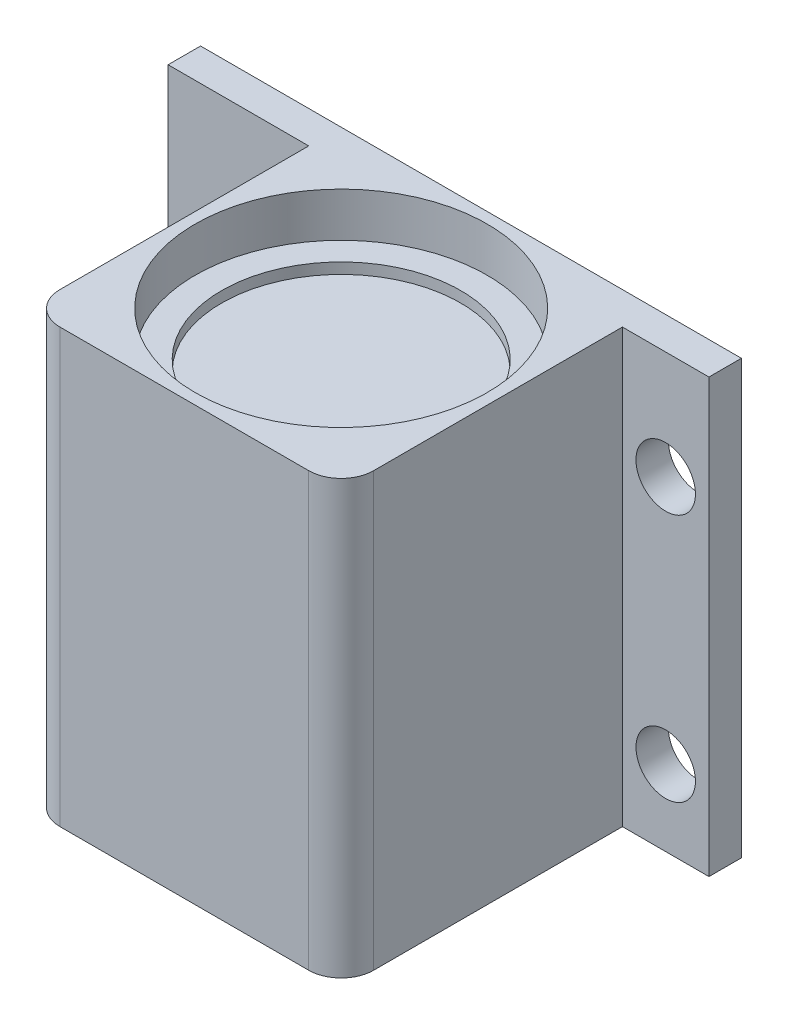
ISO-10303-21;
HEADER;
FILE_DESCRIPTION(('STEP AP214'),'2;1');
FILE_NAME('part.step','',(''),(''),'','','');
FILE_SCHEMA(('AUTOMOTIVE_DESIGN { 1 0 10303 214 1 1 1 1 }'));
ENDSEC;
DATA;
#1=APPLICATION_CONTEXT('core data for automotive mechanical design processes');
#2=APPLICATION_PROTOCOL_DEFINITION('international standard','automotive_design',2000,#1);
#3=PRODUCT_CONTEXT('',#1,'mechanical');
#4=PRODUCT('Part','Part','',(#3));
#5=PRODUCT_RELATED_PRODUCT_CATEGORY('part','',(#4));
#6=PRODUCT_DEFINITION_FORMATION('','',#4);
#7=PRODUCT_DEFINITION_CONTEXT('part definition',#1,'design');
#8=PRODUCT_DEFINITION('design','',#6,#7);
#9=PRODUCT_DEFINITION_SHAPE('','',#8);
#10=(LENGTH_UNIT() NAMED_UNIT(*) SI_UNIT(.MILLI.,.METRE.));
#11=(NAMED_UNIT(*) PLANE_ANGLE_UNIT() SI_UNIT($,.RADIAN.));
#12=(NAMED_UNIT(*) SI_UNIT($,.STERADIAN.) SOLID_ANGLE_UNIT());
#13=UNCERTAINTY_MEASURE_WITH_UNIT(LENGTH_MEASURE(1.E-05),#10,'distance_accuracy_value','');
#14=(GEOMETRIC_REPRESENTATION_CONTEXT(3) GLOBAL_UNCERTAINTY_ASSIGNED_CONTEXT((#13)) GLOBAL_UNIT_ASSIGNED_CONTEXT((#10,
#11,#12)) REPRESENTATION_CONTEXT('',''));
#15=CARTESIAN_POINT('',(0.,0.,0.));
#16=DIRECTION('',(0.,0.,1.));
#17=DIRECTION('',(1.,0.,0.));
#18=AXIS2_PLACEMENT_3D('',#15,#16,#17);
#19=CARTESIAN_POINT('',(0.,0.,0.));
#20=DIRECTION('',(0.,-1.,0.));
#21=DIRECTION('',(0.,0.,-1.));
#22=AXIS2_PLACEMENT_3D('',#19,#20,#21);
#23=PLANE('',#22);
#24=DIRECTION('',(1.,0.,0.));
#25=VECTOR('',#24,1.);
#26=CARTESIAN_POINT('',(14.5,0.,14.5));
#27=LINE('',#26,#25);
#28=CARTESIAN_POINT('',(-11.5,0.,14.5));
#29=VERTEX_POINT('',#28);
#30=CARTESIAN_POINT('',(11.5,0.,14.5));
#31=VERTEX_POINT('',#30);
#32=EDGE_CURVE('E273',#29,#31,#27,.T.);
#33=ORIENTED_EDGE('',*,*,#32,.T.);
#34=CARTESIAN_POINT('',(11.5,0.,11.5));
#35=DIRECTION('',(0.,-1.,0.));
#36=DIRECTION('',(0.,0.,-1.));
#37=AXIS2_PLACEMENT_3D('',#34,#35,#36);
#38=CIRCLE('',#37,3.);
#39=CARTESIAN_POINT('',(14.5,0.,11.5));
#40=VERTEX_POINT('',#39);
#41=EDGE_CURVE('E255',#31,#40,#38,.F.);
#42=ORIENTED_EDGE('',*,*,#41,.T.);
#43=DIRECTION('',(0.,0.,-1.));
#44=VECTOR('',#43,1.);
#45=CARTESIAN_POINT('',(14.5,0.,-11.5));
#46=LINE('',#45,#44);
#47=CARTESIAN_POINT('',(14.5,0.,-11.5));
#48=VERTEX_POINT('',#47);
#49=EDGE_CURVE('E271',#40,#48,#46,.T.);
#50=ORIENTED_EDGE('',*,*,#49,.T.);
#51=DIRECTION('',(1.,0.,0.));
#52=VECTOR('',#51,1.);
#53=CARTESIAN_POINT('',(22.5,0.,-11.5));
#54=LINE('',#53,#52);
#55=CARTESIAN_POINT('',(22.5,0.,-11.5));
#56=VERTEX_POINT('',#55);
#57=EDGE_CURVE('E283',#48,#56,#54,.T.);
#58=ORIENTED_EDGE('',*,*,#57,.T.);
#59=DIRECTION('',(0.,0.,-1.));
#60=VECTOR('',#59,1.);
#61=CARTESIAN_POINT('',(22.5,0.,-14.5));
#62=LINE('',#61,#60);
#63=CARTESIAN_POINT('',(22.5,0.,-14.5));
#64=VERTEX_POINT('',#63);
#65=EDGE_CURVE('E134',#56,#64,#62,.T.);
#66=ORIENTED_EDGE('',*,*,#65,.T.);
#67=DIRECTION('',(-1.,0.,0.));
#68=VECTOR('',#67,1.);
#69=CARTESIAN_POINT('',(-22.5,0.,-14.5));
#70=LINE('',#69,#68);
#71=CARTESIAN_POINT('',(-27.5000000000003,0.,-14.5));
#72=VERTEX_POINT('',#71);
#73=EDGE_CURVE('E121',#64,#72,#70,.T.);
#74=ORIENTED_EDGE('',*,*,#73,.T.);
#75=DIRECTION('',(0.,0.,1.));
#76=VECTOR('',#75,1.);
#77=CARTESIAN_POINT('',(-27.5000000000003,0.,-54.8112887414928));
#78=LINE('',#77,#76);
#79=CARTESIAN_POINT('',(-27.5000000000003,0.,-11.5));
#80=VERTEX_POINT('',#79);
#81=EDGE_CURVE('E129',#72,#80,#78,.T.);
#82=ORIENTED_EDGE('',*,*,#81,.T.);
#83=DIRECTION('',(1.,0.,0.));
#84=VECTOR('',#83,1.);
#85=CARTESIAN_POINT('',(-14.5,0.,-11.5));
#86=LINE('',#85,#84);
#87=CARTESIAN_POINT('',(-14.5,0.,-11.5));
#88=VERTEX_POINT('',#87);
#89=EDGE_CURVE('E293',#80,#88,#86,.T.);
#90=ORIENTED_EDGE('',*,*,#89,.T.);
#91=DIRECTION('',(0.,0.,1.));
#92=VECTOR('',#91,1.);
#93=CARTESIAN_POINT('',(-14.5,0.,14.5));
#94=LINE('',#93,#92);
#95=CARTESIAN_POINT('',(-14.5,0.,11.5));
#96=VERTEX_POINT('',#95);
#97=EDGE_CURVE('E286',#88,#96,#94,.T.);
#98=ORIENTED_EDGE('',*,*,#97,.T.);
#99=CARTESIAN_POINT('',(-11.5,0.,11.5));
#100=DIRECTION('',(0.,-1.,0.));
#101=DIRECTION('',(0.,0.,-1.));
#102=AXIS2_PLACEMENT_3D('',#99,#100,#101);
#103=CIRCLE('',#102,3.);
#104=EDGE_CURVE('E248',#96,#29,#103,.F.);
#105=ORIENTED_EDGE('',*,*,#104,.T.);
#106=EDGE_LOOP('',(#33,#42,#50,#58,#66,#74,#82,#90,#98,#105));
#107=FACE_BOUND('',#106,.T.);
#108=CARTESIAN_POINT('',(0.,1.2E-05,0.));
#109=DIRECTION('',(0.,1.,0.));
#110=DIRECTION('',(0.,0.,1.));
#111=AXIS2_PLACEMENT_3D('',#108,#109,#110);
#112=CIRCLE('',#111,13.5);
#113=CARTESIAN_POINT('',(0.,1.2E-05,13.5));
#114=VERTEX_POINT('',#113);
#115=EDGE_CURVE('E205',#114,#114,#112,.T.);
#116=ORIENTED_EDGE('',*,*,#115,.F.);
#117=EDGE_LOOP('',(#116));
#118=FACE_BOUND('',#117,.T.);
#119=ADVANCED_FACE('F43',(#107,#118),#23,.F.);
#120=CARTESIAN_POINT('',(97.4999999999998,-39.9999999999999,-34.4999999999999));
#121=DIRECTION('',(0.,-1.,0.));
#122=DIRECTION('',(0.,0.,-1.));
#123=AXIS2_PLACEMENT_3D('',#120,#121,#122);
#124=PLANE('',#123);
#125=DIRECTION('',(0.,0.,-1.));
#126=VECTOR('',#125,1.);
#127=CARTESIAN_POINT('',(14.5,-40.,-11.4999999999999));
#128=LINE('',#127,#126);
#129=CARTESIAN_POINT('',(14.5,-40.,11.5));
#130=VERTEX_POINT('',#129);
#131=CARTESIAN_POINT('',(14.5,-40.,-11.5));
#132=VERTEX_POINT('',#131);
#133=EDGE_CURVE('E261',#130,#132,#128,.T.);
#134=ORIENTED_EDGE('',*,*,#133,.F.);
#135=CARTESIAN_POINT('',(11.5,-40.,11.5));
#136=DIRECTION('',(0.,-1.,0.));
#137=DIRECTION('',(0.,0.,-1.));
#138=AXIS2_PLACEMENT_3D('',#135,#136,#137);
#139=CIRCLE('',#138,3.);
#140=CARTESIAN_POINT('',(11.5,-40.,14.5));
#141=VERTEX_POINT('',#140);
#142=EDGE_CURVE('E55',#130,#141,#139,.T.);
#143=ORIENTED_EDGE('',*,*,#142,.T.);
#144=DIRECTION('',(1.,0.,0.));
#145=VECTOR('',#144,1.);
#146=CARTESIAN_POINT('',(14.5,-40.,14.5));
#147=LINE('',#146,#145);
#148=CARTESIAN_POINT('',(-11.5,-40.,14.5));
#149=VERTEX_POINT('',#148);
#150=EDGE_CURVE('E263',#149,#141,#147,.T.);
#151=ORIENTED_EDGE('',*,*,#150,.F.);
#152=CARTESIAN_POINT('',(-11.5,-40.,11.5));
#153=DIRECTION('',(0.,-1.,0.));
#154=DIRECTION('',(0.,0.,-1.));
#155=AXIS2_PLACEMENT_3D('',#152,#153,#154);
#156=CIRCLE('',#155,3.);
#157=CARTESIAN_POINT('',(-14.5,-40.,11.5));
#158=VERTEX_POINT('',#157);
#159=EDGE_CURVE('E56',#149,#158,#156,.T.);
#160=ORIENTED_EDGE('',*,*,#159,.T.);
#161=DIRECTION('',(0.,0.,1.));
#162=VECTOR('',#161,1.);
#163=CARTESIAN_POINT('',(-14.5,-40.,14.5000000000001));
#164=LINE('',#163,#162);
#165=CARTESIAN_POINT('',(-14.5,-40.,-11.5));
#166=VERTEX_POINT('',#165);
#167=EDGE_CURVE('E270',#166,#158,#164,.T.);
#168=ORIENTED_EDGE('',*,*,#167,.F.);
#169=DIRECTION('',(1.,0.,0.));
#170=VECTOR('',#169,1.);
#171=CARTESIAN_POINT('',(-14.5,-40.,-11.5));
#172=LINE('',#171,#170);
#173=CARTESIAN_POINT('',(-27.5000000000003,-40.,-11.5));
#174=VERTEX_POINT('',#173);
#175=EDGE_CURVE('E139',#174,#166,#172,.T.);
#176=ORIENTED_EDGE('',*,*,#175,.F.);
#177=DIRECTION('',(0.,0.,1.));
#178=VECTOR('',#177,1.);
#179=CARTESIAN_POINT('',(-27.5000000000003,-40.,-54.8112887414928));
#180=LINE('',#179,#178);
#181=CARTESIAN_POINT('',(-27.5000000000003,-40.,-14.5));
#182=VERTEX_POINT('',#181);
#183=EDGE_CURVE('E147',#182,#174,#180,.T.);
#184=ORIENTED_EDGE('',*,*,#183,.F.);
#185=DIRECTION('',(-1.,0.,0.));
#186=VECTOR('',#185,1.);
#187=CARTESIAN_POINT('',(-22.5,-40.,-14.5));
#188=LINE('',#187,#186);
#189=CARTESIAN_POINT('',(22.5,-40.,-14.5));
#190=VERTEX_POINT('',#189);
#191=EDGE_CURVE('E141',#190,#182,#188,.T.);
#192=ORIENTED_EDGE('',*,*,#191,.F.);
#193=DIRECTION('',(0.,0.,-1.));
#194=VECTOR('',#193,1.);
#195=CARTESIAN_POINT('',(22.5,-40.,-14.4999999999999));
#196=LINE('',#195,#194);
#197=CARTESIAN_POINT('',(22.5,-40.,-11.5));
#198=VERTEX_POINT('',#197);
#199=EDGE_CURVE('E301',#198,#190,#196,.T.);
#200=ORIENTED_EDGE('',*,*,#199,.F.);
#201=DIRECTION('',(1.,0.,0.));
#202=VECTOR('',#201,1.);
#203=CARTESIAN_POINT('',(22.5,-40.,-11.5));
#204=LINE('',#203,#202);
#205=EDGE_CURVE('E306',#132,#198,#204,.T.);
#206=ORIENTED_EDGE('',*,*,#205,.F.);
#207=EDGE_LOOP('',(#134,#143,#151,#160,#168,#176,#184,#192,#200,#206));
#208=FACE_BOUND('',#207,.T.);
#209=ADVANCED_FACE('F230',(#208),#124,.T.);
#210=CARTESIAN_POINT('',(-14.5,-93.5350352572967,-11.5));
#211=DIRECTION('',(0.,0.,1.));
#212=DIRECTION('',(1.,0.,0.));
#213=AXIS2_PLACEMENT_3D('',#210,#211,#212);
#214=PLANE('',#213);
#215=CARTESIAN_POINT('',(-18.5,-9.99999999999992,-11.5));
#216=DIRECTION('',(0.,0.,1.));
#217=DIRECTION('',(1.,0.,0.));
#218=AXIS2_PLACEMENT_3D('',#215,#216,#217);
#219=CIRCLE('',#218,2.75);
#220=CARTESIAN_POINT('',(-15.75,-9.99999999999992,-11.5));
#221=VERTEX_POINT('',#220);
#222=EDGE_CURVE('E169',#221,#221,#219,.T.);
#223=ORIENTED_EDGE('',*,*,#222,.F.);
#224=EDGE_LOOP('',(#223));
#225=FACE_BOUND('',#224,.T.);
#226=CARTESIAN_POINT('',(-18.5,-33.,-11.5));
#227=DIRECTION('',(0.,0.,1.));
#228=DIRECTION('',(1.,0.,0.));
#229=AXIS2_PLACEMENT_3D('',#226,#227,#228);
#230=CIRCLE('',#229,2.75);
#231=CARTESIAN_POINT('',(-15.75,-33.,-11.5));
#232=VERTEX_POINT('',#231);
#233=EDGE_CURVE('E184',#232,#232,#230,.T.);
#234=ORIENTED_EDGE('',*,*,#233,.F.);
#235=EDGE_LOOP('',(#234));
#236=FACE_BOUND('',#235,.T.);
#237=ORIENTED_EDGE('',*,*,#89,.F.);
#238=DIRECTION('',(0.,-1.,0.));
#239=VECTOR('',#238,1.);
#240=CARTESIAN_POINT('',(-27.5000000000003,0.,-11.5));
#241=LINE('',#240,#239);
#242=EDGE_CURVE('E155',#80,#174,#241,.T.);
#243=ORIENTED_EDGE('',*,*,#242,.T.);
#244=ORIENTED_EDGE('',*,*,#175,.T.);
#245=DIRECTION('',(0.,1.,0.));
#246=VECTOR('',#245,1.);
#247=CARTESIAN_POINT('',(-14.5,-93.5350352572967,-11.5));
#248=LINE('',#247,#246);
#249=EDGE_CURVE('E300',#166,#88,#248,.T.);
#250=ORIENTED_EDGE('',*,*,#249,.T.);
#251=EDGE_LOOP('',(#237,#243,#244,#250));
#252=FACE_BOUND('',#251,.T.);
#253=ADVANCED_FACE('F322',(#225,#236,#252),#214,.T.);
#254=CARTESIAN_POINT('',(-14.5,-93.5350352572967,14.5));
#255=DIRECTION('',(-1.,0.,0.));
#256=DIRECTION('',(0.,0.,1.));
#257=AXIS2_PLACEMENT_3D('',#254,#255,#256);
#258=PLANE('',#257);
#259=ORIENTED_EDGE('',*,*,#167,.T.);
#260=DIRECTION('',(0.,1.,0.));
#261=VECTOR('',#260,1.);
#262=CARTESIAN_POINT('',(-14.5,-93.5350352572967,11.5));
#263=LINE('',#262,#261);
#264=EDGE_CURVE('E11',#158,#96,#263,.T.);
#265=ORIENTED_EDGE('',*,*,#264,.T.);
#266=ORIENTED_EDGE('',*,*,#97,.F.);
#267=ORIENTED_EDGE('',*,*,#249,.F.);
#268=EDGE_LOOP('',(#259,#265,#266,#267));
#269=FACE_BOUND('',#268,.T.);
#270=ADVANCED_FACE('F324',(#269),#258,.T.);
#271=CARTESIAN_POINT('',(14.5,-93.5350352572967,14.5));
#272=DIRECTION('',(0.,0.,1.));
#273=DIRECTION('',(1.,0.,0.));
#274=AXIS2_PLACEMENT_3D('',#271,#272,#273);
#275=PLANE('',#274);
#276=ORIENTED_EDGE('',*,*,#150,.T.);
#277=DIRECTION('',(0.,1.,0.));
#278=VECTOR('',#277,1.);
#279=CARTESIAN_POINT('',(11.5,-93.5350352572967,14.5));
#280=LINE('',#279,#278);
#281=EDGE_CURVE('E244',#141,#31,#280,.T.);
#282=ORIENTED_EDGE('',*,*,#281,.T.);
#283=ORIENTED_EDGE('',*,*,#32,.F.);
#284=DIRECTION('',(0.,1.,0.));
#285=VECTOR('',#284,1.);
#286=CARTESIAN_POINT('',(-11.5,-93.5350352572967,14.5));
#287=LINE('',#286,#285);
#288=EDGE_CURVE('E240',#29,#149,#287,.F.);
#289=ORIENTED_EDGE('',*,*,#288,.T.);
#290=EDGE_LOOP('',(#276,#282,#283,#289));
#291=FACE_BOUND('',#290,.T.);
#292=ADVANCED_FACE('F267',(#291),#275,.T.);
#293=CARTESIAN_POINT('',(14.5,-93.5350352572967,-11.5));
#294=DIRECTION('',(1.,0.,0.));
#295=DIRECTION('',(0.,0.,-1.));
#296=AXIS2_PLACEMENT_3D('',#293,#294,#295);
#297=PLANE('',#296);
#298=ORIENTED_EDGE('',*,*,#49,.F.);
#299=DIRECTION('',(0.,1.,0.));
#300=VECTOR('',#299,1.);
#301=CARTESIAN_POINT('',(14.5,-93.5350352572967,11.5));
#302=LINE('',#301,#300);
#303=EDGE_CURVE('E70',#40,#130,#302,.F.);
#304=ORIENTED_EDGE('',*,*,#303,.T.);
#305=ORIENTED_EDGE('',*,*,#133,.T.);
#306=DIRECTION('',(0.,1.,0.));
#307=VECTOR('',#306,1.);
#308=CARTESIAN_POINT('',(14.5,-93.5350352572967,-11.5));
#309=LINE('',#308,#307);
#310=EDGE_CURVE('E277',#132,#48,#309,.T.);
#311=ORIENTED_EDGE('',*,*,#310,.T.);
#312=EDGE_LOOP('',(#298,#304,#305,#311));
#313=FACE_BOUND('',#312,.T.);
#314=ADVANCED_FACE('F276',(#313),#297,.T.);
#315=CARTESIAN_POINT('',(22.5,-93.5350352572967,-11.5));
#316=DIRECTION('',(0.,0.,1.));
#317=DIRECTION('',(1.,0.,0.));
#318=AXIS2_PLACEMENT_3D('',#315,#316,#317);
#319=PLANE('',#318);
#320=CARTESIAN_POINT('',(18.5,-33.,-11.5));
#321=DIRECTION('',(0.,0.,1.));
#322=DIRECTION('',(1.,0.,0.));
#323=AXIS2_PLACEMENT_3D('',#320,#321,#322);
#324=CIRCLE('',#323,2.75);
#325=CARTESIAN_POINT('',(21.25,-33.,-11.5));
#326=VERTEX_POINT('',#325);
#327=EDGE_CURVE('E163',#326,#326,#324,.T.);
#328=ORIENTED_EDGE('',*,*,#327,.F.);
#329=EDGE_LOOP('',(#328));
#330=FACE_BOUND('',#329,.T.);
#331=CARTESIAN_POINT('',(18.5,-9.99999999999992,-11.5));
#332=DIRECTION('',(0.,0.,1.));
#333=DIRECTION('',(1.,0.,0.));
#334=AXIS2_PLACEMENT_3D('',#331,#332,#333);
#335=CIRCLE('',#334,2.75);
#336=CARTESIAN_POINT('',(21.25,-9.99999999999992,-11.5));
#337=VERTEX_POINT('',#336);
#338=EDGE_CURVE('E180',#337,#337,#335,.T.);
#339=ORIENTED_EDGE('',*,*,#338,.F.);
#340=EDGE_LOOP('',(#339));
#341=FACE_BOUND('',#340,.T.);
#342=ORIENTED_EDGE('',*,*,#310,.F.);
#343=ORIENTED_EDGE('',*,*,#205,.T.);
#344=DIRECTION('',(0.,1.,0.));
#345=VECTOR('',#344,1.);
#346=CARTESIAN_POINT('',(22.5,-93.5350352572967,-11.5));
#347=LINE('',#346,#345);
#348=EDGE_CURVE('E304',#198,#56,#347,.T.);
#349=ORIENTED_EDGE('',*,*,#348,.T.);
#350=ORIENTED_EDGE('',*,*,#57,.F.);
#351=EDGE_LOOP('',(#342,#343,#349,#350));
#352=FACE_BOUND('',#351,.T.);
#353=ADVANCED_FACE('F351',(#330,#341,#352),#319,.T.);
#354=CARTESIAN_POINT('',(22.5,-93.5350352572967,-14.5));
#355=DIRECTION('',(1.,0.,0.));
#356=DIRECTION('',(0.,0.,-1.));
#357=AXIS2_PLACEMENT_3D('',#354,#355,#356);
#358=PLANE('',#357);
#359=ORIENTED_EDGE('',*,*,#348,.F.);
#360=ORIENTED_EDGE('',*,*,#199,.T.);
#361=DIRECTION('',(0.,1.,0.));
#362=VECTOR('',#361,1.);
#363=CARTESIAN_POINT('',(22.5,-93.5350352572967,-14.5));
#364=LINE('',#363,#362);
#365=EDGE_CURVE('E297',#190,#64,#364,.T.);
#366=ORIENTED_EDGE('',*,*,#365,.T.);
#367=ORIENTED_EDGE('',*,*,#65,.F.);
#368=EDGE_LOOP('',(#359,#360,#366,#367));
#369=FACE_BOUND('',#368,.T.);
#370=ADVANCED_FACE('F354',(#369),#358,.T.);
#371=CARTESIAN_POINT('',(-22.5,-93.5350352572967,-14.5));
#372=DIRECTION('',(0.,0.,-1.));
#373=DIRECTION('',(-1.,0.,0.));
#374=AXIS2_PLACEMENT_3D('',#371,#372,#373);
#375=PLANE('',#374);
#376=CARTESIAN_POINT('',(18.5,-33.,-14.5));
#377=DIRECTION('',(0.,0.,-1.));
#378=DIRECTION('',(-1.,0.,0.));
#379=AXIS2_PLACEMENT_3D('',#376,#377,#378);
#380=CIRCLE('',#379,2.75);
#381=CARTESIAN_POINT('',(15.75,-33.,-14.5));
#382=VERTEX_POINT('',#381);
#383=EDGE_CURVE('E164',#382,#382,#380,.T.);
#384=ORIENTED_EDGE('',*,*,#383,.F.);
#385=EDGE_LOOP('',(#384));
#386=FACE_BOUND('',#385,.T.);
#387=CARTESIAN_POINT('',(-18.5,-9.99999999999992,-14.5));
#388=DIRECTION('',(0.,0.,-1.));
#389=DIRECTION('',(-1.,0.,0.));
#390=AXIS2_PLACEMENT_3D('',#387,#388,#389);
#391=CIRCLE('',#390,2.75);
#392=CARTESIAN_POINT('',(-21.25,-9.99999999999992,-14.5));
#393=VERTEX_POINT('',#392);
#394=EDGE_CURVE('E173',#393,#393,#391,.T.);
#395=ORIENTED_EDGE('',*,*,#394,.F.);
#396=EDGE_LOOP('',(#395));
#397=FACE_BOUND('',#396,.T.);
#398=CARTESIAN_POINT('',(18.5,-9.99999999999992,-14.5));
#399=DIRECTION('',(0.,0.,-1.));
#400=DIRECTION('',(-1.,0.,0.));
#401=AXIS2_PLACEMENT_3D('',#398,#399,#400);
#402=CIRCLE('',#401,2.75);
#403=CARTESIAN_POINT('',(15.75,-9.99999999999992,-14.5));
#404=VERTEX_POINT('',#403);
#405=EDGE_CURVE('E181',#404,#404,#402,.T.);
#406=ORIENTED_EDGE('',*,*,#405,.F.);
#407=EDGE_LOOP('',(#406));
#408=FACE_BOUND('',#407,.T.);
#409=CARTESIAN_POINT('',(-18.5,-33.,-14.5));
#410=DIRECTION('',(0.,0.,-1.));
#411=DIRECTION('',(-1.,0.,0.));
#412=AXIS2_PLACEMENT_3D('',#409,#410,#411);
#413=CIRCLE('',#412,2.75);
#414=CARTESIAN_POINT('',(-21.25,-33.,-14.5));
#415=VERTEX_POINT('',#414);
#416=EDGE_CURVE('E186',#415,#415,#413,.T.);
#417=ORIENTED_EDGE('',*,*,#416,.F.);
#418=EDGE_LOOP('',(#417));
#419=FACE_BOUND('',#418,.T.);
#420=ORIENTED_EDGE('',*,*,#365,.F.);
#421=ORIENTED_EDGE('',*,*,#191,.T.);
#422=DIRECTION('',(0.,-1.,0.));
#423=VECTOR('',#422,1.);
#424=CARTESIAN_POINT('',(-27.5000000000003,0.,-14.5));
#425=LINE('',#424,#423);
#426=EDGE_CURVE('E142',#72,#182,#425,.T.);
#427=ORIENTED_EDGE('',*,*,#426,.F.);
#428=ORIENTED_EDGE('',*,*,#73,.F.);
#429=EDGE_LOOP('',(#420,#421,#427,#428));
#430=FACE_BOUND('',#429,.T.);
#431=ADVANCED_FACE('F145',(#386,#397,#408,#419,#430),#375,.T.);
#432=CARTESIAN_POINT('',(0.,1.2E-05,0.));
#433=DIRECTION('',(0.,-1.,0.));
#434=DIRECTION('',(0.,0.,-1.));
#435=AXIS2_PLACEMENT_3D('',#432,#433,#434);
#436=CYLINDRICAL_SURFACE('',#435,13.5);
#437=ORIENTED_EDGE('',*,*,#115,.T.);
#438=EDGE_LOOP('',(#437));
#439=FACE_BOUND('',#438,.T.);
#440=CARTESIAN_POINT('',(0.,-4.1,0.));
#441=DIRECTION('',(0.,1.,0.));
#442=DIRECTION('',(0.,0.,1.));
#443=AXIS2_PLACEMENT_3D('',#440,#441,#442);
#444=CIRCLE('',#443,13.5);
#445=CARTESIAN_POINT('',(0.,-4.1,13.5));
#446=VERTEX_POINT('',#445);
#447=EDGE_CURVE('E196',#446,#446,#444,.T.);
#448=ORIENTED_EDGE('',*,*,#447,.F.);
#449=EDGE_LOOP('',(#448));
#450=FACE_BOUND('',#449,.T.);
#451=ADVANCED_FACE('F213',(#439,#450),#436,.F.);
#452=CARTESIAN_POINT('',(0.,-4.1,0.));
#453=DIRECTION('',(0.,1.,0.));
#454=DIRECTION('',(0.,0.,1.));
#455=AXIS2_PLACEMENT_3D('',#452,#453,#454);
#456=PLANE('',#455);
#457=CARTESIAN_POINT('',(0.,-4.1,0.));
#458=DIRECTION('',(0.,1.,0.));
#459=DIRECTION('',(0.,0.,1.));
#460=AXIS2_PLACEMENT_3D('',#457,#458,#459);
#461=CIRCLE('',#460,11.05);
#462=CARTESIAN_POINT('',(0.,-4.1,11.05));
#463=VERTEX_POINT('',#462);
#464=EDGE_CURVE('E192',#463,#463,#461,.T.);
#465=ORIENTED_EDGE('',*,*,#464,.F.);
#466=EDGE_LOOP('',(#465));
#467=FACE_BOUND('',#466,.T.);
#468=ORIENTED_EDGE('',*,*,#447,.T.);
#469=EDGE_LOOP('',(#468));
#470=FACE_BOUND('',#469,.T.);
#471=ADVANCED_FACE('F223',(#467,#470),#456,.T.);
#472=CARTESIAN_POINT('',(0.,-5.1,0.));
#473=DIRECTION('',(0.,1.,0.));
#474=DIRECTION('',(0.,0.,1.));
#475=AXIS2_PLACEMENT_3D('',#472,#473,#474);
#476=CYLINDRICAL_SURFACE('',#475,11.05);
#477=CARTESIAN_POINT('',(0.,-5.1,0.));
#478=DIRECTION('',(0.,1.,0.));
#479=DIRECTION('',(0.,0.,1.));
#480=AXIS2_PLACEMENT_3D('',#477,#478,#479);
#481=CIRCLE('',#480,11.05);
#482=CARTESIAN_POINT('',(0.,-5.1,11.05));
#483=VERTEX_POINT('',#482);
#484=EDGE_CURVE('E193',#483,#483,#481,.T.);
#485=ORIENTED_EDGE('',*,*,#484,.F.);
#486=EDGE_LOOP('',(#485));
#487=FACE_BOUND('',#486,.T.);
#488=ORIENTED_EDGE('',*,*,#464,.T.);
#489=EDGE_LOOP('',(#488));
#490=FACE_BOUND('',#489,.T.);
#491=ADVANCED_FACE('F383',(#487,#490),#476,.F.);
#492=CARTESIAN_POINT('',(0.,-5.1,0.));
#493=DIRECTION('',(0.,1.,0.));
#494=DIRECTION('',(0.,0.,1.));
#495=AXIS2_PLACEMENT_3D('',#492,#493,#494);
#496=PLANE('',#495);
#497=ORIENTED_EDGE('',*,*,#484,.T.);
#498=EDGE_LOOP('',(#497));
#499=FACE_BOUND('',#498,.T.);
#500=ADVANCED_FACE('F380',(#499),#496,.T.);
#501=CARTESIAN_POINT('',(-18.5,-33.,-11.5));
#502=DIRECTION('',(0.,0.,1.));
#503=DIRECTION('',(1.,0.,0.));
#504=AXIS2_PLACEMENT_3D('',#501,#502,#503);
#505=CYLINDRICAL_SURFACE('',#504,2.75);
#506=ORIENTED_EDGE('',*,*,#233,.T.);
#507=EDGE_LOOP('',(#506));
#508=FACE_BOUND('',#507,.T.);
#509=ORIENTED_EDGE('',*,*,#416,.T.);
#510=EDGE_LOOP('',(#509));
#511=FACE_BOUND('',#510,.T.);
#512=ADVANCED_FACE('F372',(#508,#511),#505,.F.);
#513=CARTESIAN_POINT('',(18.5,-9.99999999999992,-11.5));
#514=DIRECTION('',(0.,0.,1.));
#515=DIRECTION('',(1.,0.,0.));
#516=AXIS2_PLACEMENT_3D('',#513,#514,#515);
#517=CYLINDRICAL_SURFACE('',#516,2.75);
#518=ORIENTED_EDGE('',*,*,#338,.T.);
#519=EDGE_LOOP('',(#518));
#520=FACE_BOUND('',#519,.T.);
#521=ORIENTED_EDGE('',*,*,#405,.T.);
#522=EDGE_LOOP('',(#521));
#523=FACE_BOUND('',#522,.T.);
#524=ADVANCED_FACE('F376',(#520,#523),#517,.F.);
#525=CARTESIAN_POINT('',(-18.5,-9.99999999999992,-11.5));
#526=DIRECTION('',(0.,0.,1.));
#527=DIRECTION('',(1.,0.,0.));
#528=AXIS2_PLACEMENT_3D('',#525,#526,#527);
#529=CYLINDRICAL_SURFACE('',#528,2.75);
#530=ORIENTED_EDGE('',*,*,#222,.T.);
#531=EDGE_LOOP('',(#530));
#532=FACE_BOUND('',#531,.T.);
#533=ORIENTED_EDGE('',*,*,#394,.T.);
#534=EDGE_LOOP('',(#533));
#535=FACE_BOUND('',#534,.T.);
#536=ADVANCED_FACE('F337',(#532,#535),#529,.F.);
#537=CARTESIAN_POINT('',(18.5,-33.,-11.5));
#538=DIRECTION('',(0.,0.,1.));
#539=DIRECTION('',(1.,0.,0.));
#540=AXIS2_PLACEMENT_3D('',#537,#538,#539);
#541=CYLINDRICAL_SURFACE('',#540,2.75);
#542=ORIENTED_EDGE('',*,*,#327,.T.);
#543=EDGE_LOOP('',(#542));
#544=FACE_BOUND('',#543,.T.);
#545=ORIENTED_EDGE('',*,*,#383,.T.);
#546=EDGE_LOOP('',(#545));
#547=FACE_BOUND('',#546,.T.);
#548=ADVANCED_FACE('F334',(#544,#547),#541,.F.);
#549=CARTESIAN_POINT('',(11.5,-93.5350352572967,11.5));
#550=DIRECTION('',(0.,1.,0.));
#551=DIRECTION('',(0.,0.,1.));
#552=AXIS2_PLACEMENT_3D('',#549,#550,#551);
#553=CYLINDRICAL_SURFACE('',#552,3.);
#554=ORIENTED_EDGE('',*,*,#142,.F.);
#555=ORIENTED_EDGE('',*,*,#303,.F.);
#556=ORIENTED_EDGE('',*,*,#41,.F.);
#557=ORIENTED_EDGE('',*,*,#281,.F.);
#558=EDGE_LOOP('',(#554,#555,#556,#557));
#559=FACE_BOUND('',#558,.T.);
#560=ADVANCED_FACE('F275',(#559),#553,.T.);
#561=CARTESIAN_POINT('',(-11.5,-93.5350352572967,11.5));
#562=DIRECTION('',(0.,1.,0.));
#563=DIRECTION('',(0.,0.,1.));
#564=AXIS2_PLACEMENT_3D('',#561,#562,#563);
#565=CYLINDRICAL_SURFACE('',#564,3.);
#566=ORIENTED_EDGE('',*,*,#159,.F.);
#567=ORIENTED_EDGE('',*,*,#288,.F.);
#568=ORIENTED_EDGE('',*,*,#104,.F.);
#569=ORIENTED_EDGE('',*,*,#264,.F.);
#570=EDGE_LOOP('',(#566,#567,#568,#569));
#571=FACE_BOUND('',#570,.T.);
#572=ADVANCED_FACE('F44',(#571),#565,.T.);
#573=CARTESIAN_POINT('',(-27.5000000000003,0.,-54.8112887414928));
#574=DIRECTION('',(-1.,0.,0.));
#575=DIRECTION('',(0.,-1.,0.));
#576=AXIS2_PLACEMENT_3D('',#573,#574,#575);
#577=PLANE('',#576);
#578=ORIENTED_EDGE('',*,*,#81,.F.);
#579=ORIENTED_EDGE('',*,*,#426,.T.);
#580=ORIENTED_EDGE('',*,*,#183,.T.);
#581=ORIENTED_EDGE('',*,*,#242,.F.);
#582=EDGE_LOOP('',(#578,#579,#580,#581));
#583=FACE_BOUND('',#582,.T.);
#584=ADVANCED_FACE('F149',(#583),#577,.T.);
#585=CLOSED_SHELL('',(#119,#209,#253,#270,#292,#314,#353,#370,#431,#451,#471,#491,#500,#512,
#524,#536,#548,#560,#572,#584));
#586=MANIFOLD_SOLID_BREP('B2',#585);
#587=ADVANCED_BREP_SHAPE_REPRESENTATION('',(#18,#586),#14);
#588=SHAPE_DEFINITION_REPRESENTATION(#9,#587);
ENDSEC;
END-ISO-10303-21;
